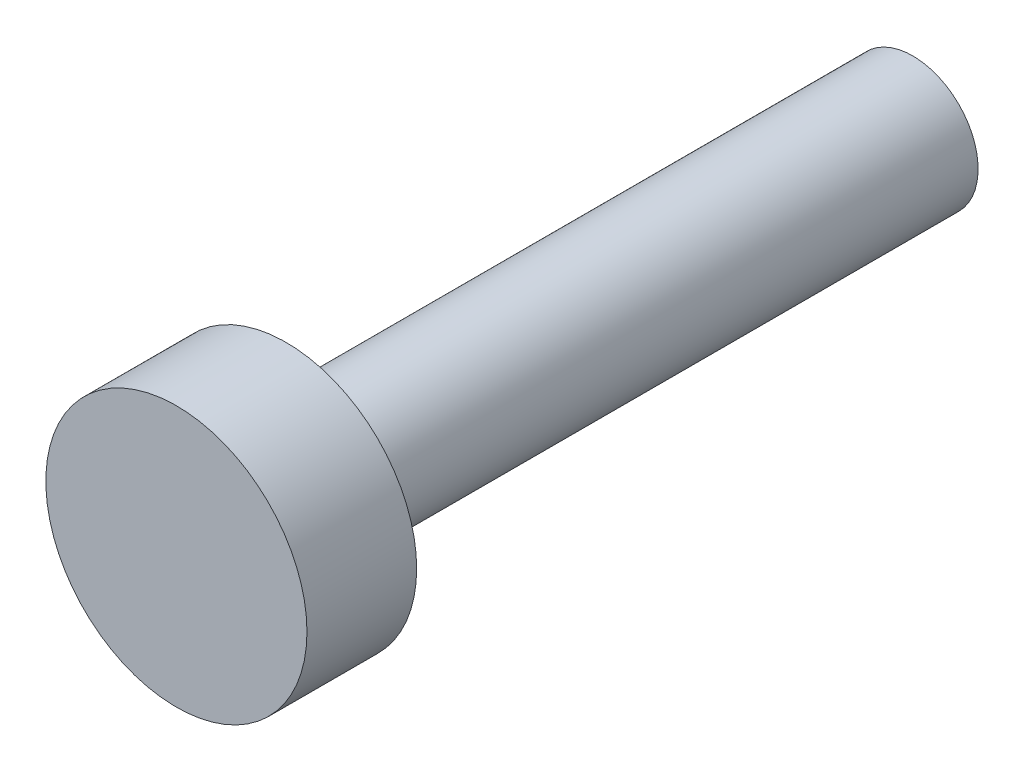
ISO-10303-21;
HEADER;
FILE_DESCRIPTION(('STEP AP214'),'2;1');
FILE_NAME('part.step','',(''),(''),'','','');
FILE_SCHEMA(('AUTOMOTIVE_DESIGN { 1 0 10303 214 1 1 1 1 }'));
ENDSEC;
DATA;
#1=APPLICATION_CONTEXT('core data for automotive mechanical design processes');
#2=APPLICATION_PROTOCOL_DEFINITION('international standard','automotive_design',2000,#1);
#3=PRODUCT_CONTEXT('',#1,'mechanical');
#4=PRODUCT('Part','Part','',(#3));
#5=PRODUCT_RELATED_PRODUCT_CATEGORY('part','',(#4));
#6=PRODUCT_DEFINITION_FORMATION('','',#4);
#7=PRODUCT_DEFINITION_CONTEXT('part definition',#1,'design');
#8=PRODUCT_DEFINITION('design','',#6,#7);
#9=PRODUCT_DEFINITION_SHAPE('','',#8);
#10=(LENGTH_UNIT() NAMED_UNIT(*) SI_UNIT(.MILLI.,.METRE.));
#11=(NAMED_UNIT(*) PLANE_ANGLE_UNIT() SI_UNIT($,.RADIAN.));
#12=(NAMED_UNIT(*) SI_UNIT($,.STERADIAN.) SOLID_ANGLE_UNIT());
#13=UNCERTAINTY_MEASURE_WITH_UNIT(LENGTH_MEASURE(1.E-05),#10,'distance_accuracy_value','');
#14=(GEOMETRIC_REPRESENTATION_CONTEXT(3) GLOBAL_UNCERTAINTY_ASSIGNED_CONTEXT((#13)) GLOBAL_UNIT_ASSIGNED_CONTEXT((#10,
#11,#12)) REPRESENTATION_CONTEXT('',''));
#15=CARTESIAN_POINT('',(0.,0.,0.));
#16=DIRECTION('',(0.,0.,1.));
#17=DIRECTION('',(1.,0.,0.));
#18=AXIS2_PLACEMENT_3D('',#15,#16,#17);
#19=CARTESIAN_POINT('',(0.,0.,2.1));
#20=DIRECTION('',(0.,0.,-1.));
#21=DIRECTION('',(-1.,0.,0.));
#22=AXIS2_PLACEMENT_3D('',#19,#20,#21);
#23=CYLINDRICAL_SURFACE('',#22,2.5);
#24=CARTESIAN_POINT('',(0.,0.,2.1));
#25=DIRECTION('',(0.,0.,1.));
#26=DIRECTION('',(1.,0.,0.));
#27=AXIS2_PLACEMENT_3D('',#24,#25,#26);
#28=CIRCLE('',#27,2.5);
#29=CARTESIAN_POINT('',(2.5,0.,2.1));
#30=VERTEX_POINT('',#29);
#31=EDGE_CURVE('E38',#30,#30,#28,.T.);
#32=ORIENTED_EDGE('',*,*,#31,.F.);
#33=EDGE_LOOP('',(#32));
#34=FACE_BOUND('',#33,.T.);
#35=CARTESIAN_POINT('',(0.,0.,0.));
#36=DIRECTION('',(0.,0.,1.));
#37=DIRECTION('',(1.,0.,0.));
#38=AXIS2_PLACEMENT_3D('',#35,#36,#37);
#39=CIRCLE('',#38,2.5);
#40=CARTESIAN_POINT('',(2.5,0.,0.));
#41=VERTEX_POINT('',#40);
#42=EDGE_CURVE('E34',#41,#41,#39,.T.);
#43=ORIENTED_EDGE('',*,*,#42,.T.);
#44=EDGE_LOOP('',(#43));
#45=FACE_BOUND('',#44,.T.);
#46=ADVANCED_FACE('F31',(#34,#45),#23,.T.);
#47=CARTESIAN_POINT('',(0.,0.,2.1));
#48=DIRECTION('',(0.,0.,1.));
#49=DIRECTION('',(1.,0.,0.));
#50=AXIS2_PLACEMENT_3D('',#47,#48,#49);
#51=PLANE('',#50);
#52=ORIENTED_EDGE('',*,*,#31,.T.);
#53=EDGE_LOOP('',(#52));
#54=FACE_BOUND('',#53,.T.);
#55=ADVANCED_FACE('F55',(#54),#51,.T.);
#56=CARTESIAN_POINT('',(0.,0.,0.));
#57=DIRECTION('',(0.,0.,1.));
#58=DIRECTION('',(1.,0.,0.));
#59=AXIS2_PLACEMENT_3D('',#56,#57,#58);
#60=PLANE('',#59);
#61=CARTESIAN_POINT('',(0.,0.,0.));
#62=DIRECTION('',(0.,0.,-1.));
#63=DIRECTION('',(-1.,0.,0.));
#64=AXIS2_PLACEMENT_3D('',#61,#62,#63);
#65=CIRCLE('',#64,1.25);
#66=CARTESIAN_POINT('',(-1.25,0.,0.));
#67=VERTEX_POINT('',#66);
#68=EDGE_CURVE('E10',#67,#67,#65,.T.);
#69=ORIENTED_EDGE('',*,*,#68,.F.);
#70=EDGE_LOOP('',(#69));
#71=FACE_BOUND('',#70,.T.);
#72=ORIENTED_EDGE('',*,*,#42,.F.);
#73=EDGE_LOOP('',(#72));
#74=FACE_BOUND('',#73,.T.);
#75=ADVANCED_FACE('F52',(#71,#74),#60,.F.);
#76=CARTESIAN_POINT('',(0.,0.,-12.));
#77=DIRECTION('',(0.,0.,1.));
#78=DIRECTION('',(1.,0.,0.));
#79=AXIS2_PLACEMENT_3D('',#76,#77,#78);
#80=CYLINDRICAL_SURFACE('',#79,1.25);
#81=CARTESIAN_POINT('',(0.,0.,-12.));
#82=DIRECTION('',(0.,0.,-1.));
#83=DIRECTION('',(-1.,0.,0.));
#84=AXIS2_PLACEMENT_3D('',#81,#82,#83);
#85=CIRCLE('',#84,1.25);
#86=CARTESIAN_POINT('',(-1.25,0.,-12.));
#87=VERTEX_POINT('',#86);
#88=EDGE_CURVE('E44',#87,#87,#85,.T.);
#89=ORIENTED_EDGE('',*,*,#88,.F.);
#90=EDGE_LOOP('',(#89));
#91=FACE_BOUND('',#90,.T.);
#92=ORIENTED_EDGE('',*,*,#68,.T.);
#93=EDGE_LOOP('',(#92));
#94=FACE_BOUND('',#93,.T.);
#95=ADVANCED_FACE('F54',(#91,#94),#80,.T.);
#96=CARTESIAN_POINT('',(0.,0.,-12.));
#97=DIRECTION('',(0.,0.,-1.));
#98=DIRECTION('',(-1.,0.,0.));
#99=AXIS2_PLACEMENT_3D('',#96,#97,#98);
#100=PLANE('',#99);
#101=ORIENTED_EDGE('',*,*,#88,.T.);
#102=EDGE_LOOP('',(#101));
#103=FACE_BOUND('',#102,.T.);
#104=ADVANCED_FACE('F61',(#103),#100,.T.);
#105=CLOSED_SHELL('',(#46,#55,#75,#95,#104));
#106=MANIFOLD_SOLID_BREP('B2',#105);
#107=ADVANCED_BREP_SHAPE_REPRESENTATION('',(#18,#106),#14);
#108=SHAPE_DEFINITION_REPRESENTATION(#9,#107);
ENDSEC;
END-ISO-10303-21;
